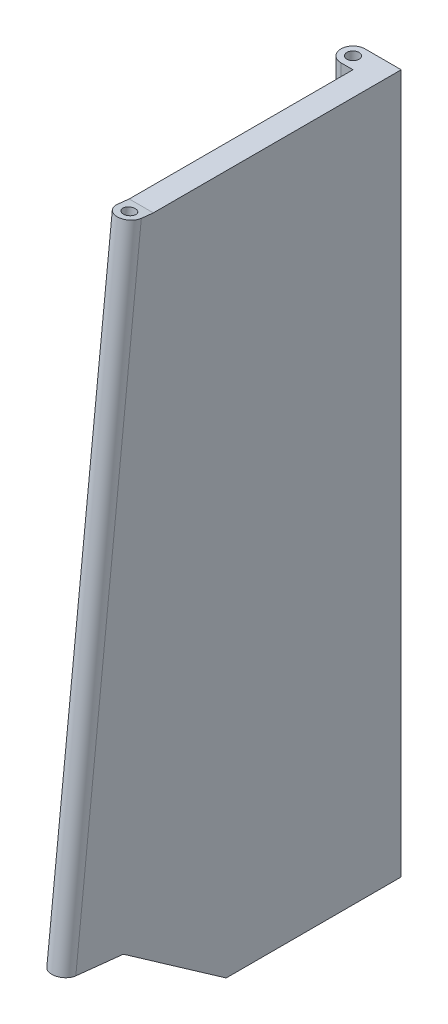
ISO-10303-21;
HEADER;
FILE_DESCRIPTION(('STEP AP214'),'2;1');
FILE_NAME('part.step','',(''),(''),'','','');
FILE_SCHEMA(('AUTOMOTIVE_DESIGN { 1 0 10303 214 1 1 1 1 }'));
ENDSEC;
DATA;
#1=APPLICATION_CONTEXT('core data for automotive mechanical design processes');
#2=APPLICATION_PROTOCOL_DEFINITION('international standard','automotive_design',2000,#1);
#3=PRODUCT_CONTEXT('',#1,'mechanical');
#4=PRODUCT('Part','Part','',(#3));
#5=PRODUCT_RELATED_PRODUCT_CATEGORY('part','',(#4));
#6=PRODUCT_DEFINITION_FORMATION('','',#4);
#7=PRODUCT_DEFINITION_CONTEXT('part definition',#1,'design');
#8=PRODUCT_DEFINITION('design','',#6,#7);
#9=PRODUCT_DEFINITION_SHAPE('','',#8);
#10=(LENGTH_UNIT() NAMED_UNIT(*) SI_UNIT(.MILLI.,.METRE.));
#11=(NAMED_UNIT(*) PLANE_ANGLE_UNIT() SI_UNIT($,.RADIAN.));
#12=(NAMED_UNIT(*) SI_UNIT($,.STERADIAN.) SOLID_ANGLE_UNIT());
#13=UNCERTAINTY_MEASURE_WITH_UNIT(LENGTH_MEASURE(1.E-05),#10,'distance_accuracy_value','');
#14=(GEOMETRIC_REPRESENTATION_CONTEXT(3) GLOBAL_UNCERTAINTY_ASSIGNED_CONTEXT((#13)) GLOBAL_UNIT_ASSIGNED_CONTEXT((#10,
#11,#12)) REPRESENTATION_CONTEXT('',''));
#15=CARTESIAN_POINT('',(0.,0.,0.));
#16=DIRECTION('',(0.,0.,1.));
#17=DIRECTION('',(1.,0.,0.));
#18=AXIS2_PLACEMENT_3D('',#15,#16,#17);
#19=CARTESIAN_POINT('',(0.,0.,0.));
#20=DIRECTION('',(1.,0.,0.));
#21=DIRECTION('',(0.,0.,-1.));
#22=AXIS2_PLACEMENT_3D('',#19,#20,#21);
#23=PLANE('',#22);
#24=DIRECTION('',(0.,-1.,0.));
#25=VECTOR('',#24,1.);
#26=CARTESIAN_POINT('',(0.,60.8284271247462,2.));
#27=LINE('',#26,#25);
#28=CARTESIAN_POINT('',(0.,58.,2.));
#29=VERTEX_POINT('',#28);
#30=CARTESIAN_POINT('',(0.,0.,2.));
#31=VERTEX_POINT('',#30);
#32=EDGE_CURVE('E49',#29,#31,#27,.T.);
#33=ORIENTED_EDGE('',*,*,#32,.T.);
#34=DIRECTION('',(0.,0.,-1.));
#35=VECTOR('',#34,1.);
#36=CARTESIAN_POINT('',(0.,0.,14.5181284096406));
#37=LINE('',#36,#35);
#38=CARTESIAN_POINT('',(0.,0.,14.5181284096406));
#39=VERTEX_POINT('',#38);
#40=EDGE_CURVE('E130',#39,#31,#37,.T.);
#41=ORIENTED_EDGE('',*,*,#40,.F.);
#42=DIRECTION('',(0.,-0.573576436351041,-0.819152044288995));
#43=VECTOR('',#42,1.);
#44=CARTESIAN_POINT('',(0.,0.,14.5181284096406));
#45=LINE('',#44,#43);
#46=CARTESIAN_POINT('',(0.,5.97493166501007,23.0512151574452));
#47=VERTEX_POINT('',#46);
#48=EDGE_CURVE('E127',#47,#39,#45,.T.);
#49=ORIENTED_EDGE('',*,*,#48,.F.);
#50=DIRECTION('',(0.,-0.104528463267654,-0.994521895368273));
#51=VECTOR('',#50,1.);
#52=CARTESIAN_POINT('',(0.,6.28486144084982,26.));
#53=LINE('',#52,#51);
#54=CARTESIAN_POINT('',(0.,6.38938990411747,26.9945218953683));
#55=VERTEX_POINT('',#54);
#56=EDGE_CURVE('E125',#55,#47,#53,.T.);
#57=ORIENTED_EDGE('',*,*,#56,.F.);
#58=DIRECTION('',(0.,-0.994521895368273,0.104528463267654));
#59=VECTOR('',#58,1.);
#60=CARTESIAN_POINT('',(0.,58.1045284632677,21.5590418054503));
#61=LINE('',#60,#59);
#62=CARTESIAN_POINT('',(0.,58.1045284632677,21.5590418054503));
#63=VERTEX_POINT('',#62);
#64=EDGE_CURVE('E176',#63,#55,#61,.T.);
#65=ORIENTED_EDGE('',*,*,#64,.F.);
#66=DIRECTION('',(0.,-0.104528463267655,-0.994521895368273));
#67=VECTOR('',#66,1.);
#68=CARTESIAN_POINT('',(0.,58.,20.564519910082));
#69=LINE('',#68,#67);
#70=CARTESIAN_POINT('',(0.,58.,20.5645199100818));
#71=VERTEX_POINT('',#70);
#72=EDGE_CURVE('E172',#63,#71,#69,.T.);
#73=ORIENTED_EDGE('',*,*,#72,.T.);
#74=DIRECTION('',(0.,0.,1.));
#75=VECTOR('',#74,1.);
#76=CARTESIAN_POINT('',(0.,58.,0.));
#77=LINE('',#76,#75);
#78=EDGE_CURVE('E75',#29,#71,#77,.T.);
#79=ORIENTED_EDGE('',*,*,#78,.F.);
#80=EDGE_LOOP('',(#33,#41,#49,#57,#65,#73,#79));
#81=FACE_BOUND('',#80,.T.);
#82=ADVANCED_FACE('F34',(#81),#23,.F.);
#83=CARTESIAN_POINT('',(2.,6.28486144084982,26.));
#84=DIRECTION('',(0.,0.994521895368273,-0.104528463267654));
#85=DIRECTION('',(0.,0.104528463267654,0.994521895368273));
#86=AXIS2_PLACEMENT_3D('',#83,#84,#85);
#87=PLANE('',#86);
#88=ORIENTED_EDGE('',*,*,#56,.T.);
#89=DIRECTION('',(-1.,0.,0.));
#90=VECTOR('',#89,1.);
#91=CARTESIAN_POINT('',(2.,5.97493166501007,23.0512151574452));
#92=LINE('',#91,#90);
#93=CARTESIAN_POINT('',(2.,5.97493166501007,23.0512151574452));
#94=VERTEX_POINT('',#93);
#95=EDGE_CURVE('E11',#94,#47,#92,.T.);
#96=ORIENTED_EDGE('',*,*,#95,.F.);
#97=DIRECTION('',(0.,-0.104528463267654,-0.994521895368273));
#98=VECTOR('',#97,1.);
#99=CARTESIAN_POINT('',(2.,6.28486144084982,26.));
#100=LINE('',#99,#98);
#101=CARTESIAN_POINT('',(2.,6.38938990411747,26.9945218953683));
#102=VERTEX_POINT('',#101);
#103=EDGE_CURVE('E83',#102,#94,#100,.T.);
#104=ORIENTED_EDGE('',*,*,#103,.F.);
#105=CARTESIAN_POINT('',(1.,6.38938990411747,26.9945218953683));
#106=DIRECTION('',(0.,-0.994521895368273,0.104528463267654));
#107=DIRECTION('',(0.,0.104528463267654,0.994521895368273));
#108=AXIS2_PLACEMENT_3D('',#105,#106,#107);
#109=CIRCLE('',#108,1.);
#110=EDGE_CURVE('E166',#102,#55,#109,.T.);
#111=ORIENTED_EDGE('',*,*,#110,.T.);
#112=EDGE_LOOP('',(#88,#96,#104,#111));
#113=FACE_BOUND('',#112,.T.);
#114=CARTESIAN_POINT('',(1.,6.38938990411747,26.9945218953683));
#115=DIRECTION('',(0.,-0.994521895368273,0.104528463267654));
#116=DIRECTION('',(0.,-0.104528463267654,-0.994521895368273));
#117=AXIS2_PLACEMENT_3D('',#114,#115,#116);
#118=CIRCLE('',#117,0.5);
#119=CARTESIAN_POINT('',(1.,6.33712567248364,26.4972609476841));
#120=VERTEX_POINT('',#119);
#121=EDGE_CURVE('E148',#120,#120,#118,.T.);
#122=ORIENTED_EDGE('',*,*,#121,.F.);
#123=EDGE_LOOP('',(#122));
#124=FACE_BOUND('',#123,.T.);
#125=ADVANCED_FACE('F36',(#113,#124),#87,.F.);
#126=CARTESIAN_POINT('',(2.,0.,14.5181284096406));
#127=DIRECTION('',(0.,0.819152044288995,-0.573576436351041));
#128=DIRECTION('',(0.,0.573576436351041,0.819152044288995));
#129=AXIS2_PLACEMENT_3D('',#126,#127,#128);
#130=PLANE('',#129);
#131=ORIENTED_EDGE('',*,*,#48,.T.);
#132=DIRECTION('',(-1.,0.,0.));
#133=VECTOR('',#132,1.);
#134=CARTESIAN_POINT('',(2.,0.,14.5181284096406));
#135=LINE('',#134,#133);
#136=CARTESIAN_POINT('',(2.,0.,14.5181284096406));
#137=VERTEX_POINT('',#136);
#138=EDGE_CURVE('E42',#137,#39,#135,.T.);
#139=ORIENTED_EDGE('',*,*,#138,.F.);
#140=DIRECTION('',(0.,-0.573576436351041,-0.819152044288995));
#141=VECTOR('',#140,1.);
#142=CARTESIAN_POINT('',(2.,0.,14.5181284096406));
#143=LINE('',#142,#141);
#144=EDGE_CURVE('E98',#94,#137,#143,.T.);
#145=ORIENTED_EDGE('',*,*,#144,.F.);
#146=ORIENTED_EDGE('',*,*,#95,.T.);
#147=EDGE_LOOP('',(#131,#139,#145,#146));
#148=FACE_BOUND('',#147,.T.);
#149=ADVANCED_FACE('F227',(#148),#130,.F.);
#150=CARTESIAN_POINT('',(2.,0.,14.5181284096406));
#151=DIRECTION('',(0.,1.,0.));
#152=DIRECTION('',(0.,0.,1.));
#153=AXIS2_PLACEMENT_3D('',#150,#151,#152);
#154=PLANE('',#153);
#155=ORIENTED_EDGE('',*,*,#40,.T.);
#156=DIRECTION('',(1.,0.,0.));
#157=VECTOR('',#156,1.);
#158=CARTESIAN_POINT('',(0.,0.,2.));
#159=LINE('',#158,#157);
#160=CARTESIAN_POINT('',(-1.,0.,2.));
#161=VERTEX_POINT('',#160);
#162=EDGE_CURVE('E145',#161,#31,#159,.T.);
#163=ORIENTED_EDGE('',*,*,#162,.F.);
#164=CARTESIAN_POINT('',(-1.,0.,1.));
#165=DIRECTION('',(0.,1.,0.));
#166=DIRECTION('',(0.,0.,-1.));
#167=AXIS2_PLACEMENT_3D('',#164,#165,#166);
#168=CIRCLE('',#167,1.);
#169=CARTESIAN_POINT('',(-1.,0.,0.));
#170=VERTEX_POINT('',#169);
#171=EDGE_CURVE('E112',#170,#161,#168,.T.);
#172=ORIENTED_EDGE('',*,*,#171,.F.);
#173=DIRECTION('',(-1.,0.,0.));
#174=VECTOR('',#173,1.);
#175=CARTESIAN_POINT('',(2.,0.,0.));
#176=LINE('',#175,#174);
#177=CARTESIAN_POINT('',(2.,0.,0.));
#178=VERTEX_POINT('',#177);
#179=EDGE_CURVE('E105',#178,#170,#176,.T.);
#180=ORIENTED_EDGE('',*,*,#179,.F.);
#181=DIRECTION('',(0.,0.,-1.));
#182=VECTOR('',#181,1.);
#183=CARTESIAN_POINT('',(2.,0.,14.5181284096406));
#184=LINE('',#183,#182);
#185=EDGE_CURVE('E91',#137,#178,#184,.T.);
#186=ORIENTED_EDGE('',*,*,#185,.F.);
#187=ORIENTED_EDGE('',*,*,#138,.T.);
#188=EDGE_LOOP('',(#155,#163,#172,#180,#186,#187));
#189=FACE_BOUND('',#188,.T.);
#190=CARTESIAN_POINT('',(-1.,0.,1.));
#191=DIRECTION('',(0.,1.,0.));
#192=DIRECTION('',(0.,0.,1.));
#193=AXIS2_PLACEMENT_3D('',#190,#191,#192);
#194=CIRCLE('',#193,0.5);
#195=CARTESIAN_POINT('',(-1.,0.,1.5));
#196=VERTEX_POINT('',#195);
#197=EDGE_CURVE('E160',#196,#196,#194,.T.);
#198=ORIENTED_EDGE('',*,*,#197,.T.);
#199=EDGE_LOOP('',(#198));
#200=FACE_BOUND('',#199,.T.);
#201=ADVANCED_FACE('F107',(#189,#200),#154,.F.);
#202=CARTESIAN_POINT('',(2.,0.,0.));
#203=DIRECTION('',(0.,0.,1.));
#204=DIRECTION('',(1.,0.,0.));
#205=AXIS2_PLACEMENT_3D('',#202,#203,#204);
#206=PLANE('',#205);
#207=ORIENTED_EDGE('',*,*,#179,.T.);
#208=DIRECTION('',(0.,-1.,0.));
#209=VECTOR('',#208,1.);
#210=CARTESIAN_POINT('',(-1.,60.8284271247462,0.));
#211=LINE('',#210,#209);
#212=CARTESIAN_POINT('',(-1.,58.,0.));
#213=VERTEX_POINT('',#212);
#214=EDGE_CURVE('E155',#213,#170,#211,.T.);
#215=ORIENTED_EDGE('',*,*,#214,.F.);
#216=DIRECTION('',(-1.,0.,0.));
#217=VECTOR('',#216,1.);
#218=CARTESIAN_POINT('',(2.,58.,0.));
#219=LINE('',#218,#217);
#220=CARTESIAN_POINT('',(2.,58.,0.));
#221=VERTEX_POINT('',#220);
#222=EDGE_CURVE('E116',#221,#213,#219,.T.);
#223=ORIENTED_EDGE('',*,*,#222,.F.);
#224=DIRECTION('',(0.,1.,0.));
#225=VECTOR('',#224,1.);
#226=CARTESIAN_POINT('',(2.,0.,0.));
#227=LINE('',#226,#225);
#228=EDGE_CURVE('E95',#178,#221,#227,.T.);
#229=ORIENTED_EDGE('',*,*,#228,.F.);
#230=EDGE_LOOP('',(#207,#215,#223,#229));
#231=FACE_BOUND('',#230,.T.);
#232=ADVANCED_FACE('F118',(#231),#206,.F.);
#233=CARTESIAN_POINT('',(2.,58.,0.));
#234=DIRECTION('',(0.,-1.,0.));
#235=DIRECTION('',(0.,0.,-1.));
#236=AXIS2_PLACEMENT_3D('',#233,#234,#235);
#237=PLANE('',#236);
#238=ORIENTED_EDGE('',*,*,#222,.T.);
#239=CARTESIAN_POINT('',(-1.,58.,1.));
#240=DIRECTION('',(0.,-1.,0.));
#241=DIRECTION('',(0.,0.,-1.));
#242=AXIS2_PLACEMENT_3D('',#239,#240,#241);
#243=CIRCLE('',#242,1.);
#244=CARTESIAN_POINT('',(-1.,58.,2.));
#245=VERTEX_POINT('',#244);
#246=EDGE_CURVE('E157',#245,#213,#243,.T.);
#247=ORIENTED_EDGE('',*,*,#246,.F.);
#248=DIRECTION('',(-1.,0.,0.));
#249=VECTOR('',#248,1.);
#250=CARTESIAN_POINT('',(0.,58.,2.));
#251=LINE('',#250,#249);
#252=EDGE_CURVE('E161',#29,#245,#251,.T.);
#253=ORIENTED_EDGE('',*,*,#252,.F.);
#254=ORIENTED_EDGE('',*,*,#78,.T.);
#255=DIRECTION('',(-1.,0.,0.));
#256=VECTOR('',#255,1.);
#257=CARTESIAN_POINT('',(2.,58.,20.5645199100818));
#258=LINE('',#257,#256);
#259=CARTESIAN_POINT('',(2.,58.,20.5645199100818));
#260=VERTEX_POINT('',#259);
#261=EDGE_CURVE('E121',#260,#71,#258,.T.);
#262=ORIENTED_EDGE('',*,*,#261,.F.);
#263=DIRECTION('',(0.,0.,1.));
#264=VECTOR('',#263,1.);
#265=CARTESIAN_POINT('',(2.,58.,0.));
#266=LINE('',#265,#264);
#267=EDGE_CURVE('E58',#221,#260,#266,.T.);
#268=ORIENTED_EDGE('',*,*,#267,.F.);
#269=EDGE_LOOP('',(#238,#247,#253,#254,#262,#268));
#270=FACE_BOUND('',#269,.T.);
#271=CARTESIAN_POINT('',(-1.,58.,1.));
#272=DIRECTION('',(0.,-1.,0.));
#273=DIRECTION('',(0.,0.,-1.));
#274=AXIS2_PLACEMENT_3D('',#271,#272,#273);
#275=CIRCLE('',#274,0.5);
#276=CARTESIAN_POINT('',(-1.,58.,0.5));
#277=VERTEX_POINT('',#276);
#278=EDGE_CURVE('E144',#277,#277,#275,.T.);
#279=ORIENTED_EDGE('',*,*,#278,.T.);
#280=EDGE_LOOP('',(#279));
#281=FACE_BOUND('',#280,.T.);
#282=ADVANCED_FACE('F205',(#270,#281),#237,.F.);
#283=CARTESIAN_POINT('',(2.,0.,0.));
#284=DIRECTION('',(1.,0.,0.));
#285=DIRECTION('',(0.,0.,-1.));
#286=AXIS2_PLACEMENT_3D('',#283,#284,#285);
#287=PLANE('',#286);
#288=ORIENTED_EDGE('',*,*,#267,.T.);
#289=DIRECTION('',(0.,0.104528463267655,0.994521895368273));
#290=VECTOR('',#289,1.);
#291=CARTESIAN_POINT('',(2.,58.,20.564519910082));
#292=LINE('',#291,#290);
#293=CARTESIAN_POINT('',(2.,58.1045284632677,21.5590418054503));
#294=VERTEX_POINT('',#293);
#295=EDGE_CURVE('E174',#260,#294,#292,.T.);
#296=ORIENTED_EDGE('',*,*,#295,.T.);
#297=DIRECTION('',(0.,-0.994521895368273,0.104528463267654));
#298=VECTOR('',#297,1.);
#299=CARTESIAN_POINT('',(2.,58.1045284632677,21.5590418054503));
#300=LINE('',#299,#298);
#301=EDGE_CURVE('E128',#294,#102,#300,.T.);
#302=ORIENTED_EDGE('',*,*,#301,.T.);
#303=ORIENTED_EDGE('',*,*,#103,.T.);
#304=ORIENTED_EDGE('',*,*,#144,.T.);
#305=ORIENTED_EDGE('',*,*,#185,.T.);
#306=ORIENTED_EDGE('',*,*,#228,.T.);
#307=EDGE_LOOP('',(#288,#296,#302,#303,#304,#305,#306));
#308=FACE_BOUND('',#307,.T.);
#309=ADVANCED_FACE('F93',(#308),#287,.T.);
#310=CARTESIAN_POINT('',(1.,58.1045284632677,21.5590418054503));
#311=DIRECTION('',(0.,-0.994521895368273,0.104528463267654));
#312=DIRECTION('',(0.,-0.104528463267654,-0.994521895368273));
#313=AXIS2_PLACEMENT_3D('',#310,#311,#312);
#314=CYLINDRICAL_SURFACE('',#313,1.);
#315=ORIENTED_EDGE('',*,*,#110,.F.);
#316=ORIENTED_EDGE('',*,*,#301,.F.);
#317=CARTESIAN_POINT('',(1.,58.1045284632677,21.5590418054503));
#318=DIRECTION('',(0.,-0.994521895368273,0.104528463267654));
#319=DIRECTION('',(0.,0.104528463267654,0.994521895368273));
#320=AXIS2_PLACEMENT_3D('',#317,#318,#319);
#321=CIRCLE('',#320,1.);
#322=EDGE_CURVE('E169',#294,#63,#321,.T.);
#323=ORIENTED_EDGE('',*,*,#322,.T.);
#324=ORIENTED_EDGE('',*,*,#64,.T.);
#325=EDGE_LOOP('',(#315,#316,#323,#324));
#326=FACE_BOUND('',#325,.T.);
#327=ADVANCED_FACE('F186',(#326),#314,.T.);
#328=CARTESIAN_POINT('',(1.,58.1045284632677,21.5590418054503));
#329=DIRECTION('',(0.,0.994521895368273,-0.104528463267654));
#330=DIRECTION('',(0.,0.104528463267654,0.994521895368273));
#331=AXIS2_PLACEMENT_3D('',#328,#329,#330);
#332=PLANE('',#331);
#333=CARTESIAN_POINT('',(1.,58.1045284632677,21.5590418054503));
#334=DIRECTION('',(0.,-0.994521895368273,0.104528463267654));
#335=DIRECTION('',(0.,-0.104528463267654,-0.994521895368273));
#336=AXIS2_PLACEMENT_3D('',#333,#334,#335);
#337=CIRCLE('',#336,0.5);
#338=CARTESIAN_POINT('',(1.,58.0522642316338,21.0617808577661));
#339=VERTEX_POINT('',#338);
#340=EDGE_CURVE('E163',#339,#339,#337,.T.);
#341=ORIENTED_EDGE('',*,*,#340,.T.);
#342=EDGE_LOOP('',(#341));
#343=FACE_BOUND('',#342,.T.);
#344=ORIENTED_EDGE('',*,*,#322,.F.);
#345=ORIENTED_EDGE('',*,*,#295,.F.);
#346=ORIENTED_EDGE('',*,*,#261,.T.);
#347=ORIENTED_EDGE('',*,*,#72,.F.);
#348=EDGE_LOOP('',(#344,#345,#346,#347));
#349=FACE_BOUND('',#348,.T.);
#350=ADVANCED_FACE('F197',(#343,#349),#332,.T.);
#351=CARTESIAN_POINT('',(1.,58.1045284632677,21.5590418054503));
#352=DIRECTION('',(0.,-0.994521895368273,0.104528463267654));
#353=DIRECTION('',(0.,-0.104528463267654,-0.994521895368273));
#354=AXIS2_PLACEMENT_3D('',#351,#352,#353);
#355=CYLINDRICAL_SURFACE('',#354,0.5);
#356=ORIENTED_EDGE('',*,*,#340,.F.);
#357=EDGE_LOOP('',(#356));
#358=FACE_BOUND('',#357,.T.);
#359=ORIENTED_EDGE('',*,*,#121,.T.);
#360=EDGE_LOOP('',(#359));
#361=FACE_BOUND('',#360,.T.);
#362=ADVANCED_FACE('F220',(#358,#361),#355,.F.);
#363=CARTESIAN_POINT('',(-1.,60.8284271247462,1.));
#364=DIRECTION('',(0.,-1.,0.));
#365=DIRECTION('',(0.,0.,-1.));
#366=AXIS2_PLACEMENT_3D('',#363,#364,#365);
#367=CYLINDRICAL_SURFACE('',#366,1.);
#368=DIRECTION('',(0.,-1.,0.));
#369=VECTOR('',#368,1.);
#370=CARTESIAN_POINT('',(-1.,60.8284271247462,2.));
#371=LINE('',#370,#369);
#372=EDGE_CURVE('E150',#245,#161,#371,.T.);
#373=ORIENTED_EDGE('',*,*,#372,.F.);
#374=ORIENTED_EDGE('',*,*,#246,.T.);
#375=ORIENTED_EDGE('',*,*,#214,.T.);
#376=ORIENTED_EDGE('',*,*,#171,.T.);
#377=EDGE_LOOP('',(#373,#374,#375,#376));
#378=FACE_BOUND('',#377,.T.);
#379=ADVANCED_FACE('F209',(#378),#367,.T.);
#380=CARTESIAN_POINT('',(0.,60.8284271247462,2.));
#381=DIRECTION('',(0.,0.,-1.));
#382=DIRECTION('',(-1.,0.,0.));
#383=AXIS2_PLACEMENT_3D('',#380,#381,#382);
#384=PLANE('',#383);
#385=ORIENTED_EDGE('',*,*,#32,.F.);
#386=ORIENTED_EDGE('',*,*,#252,.T.);
#387=ORIENTED_EDGE('',*,*,#372,.T.);
#388=ORIENTED_EDGE('',*,*,#162,.T.);
#389=EDGE_LOOP('',(#385,#386,#387,#388));
#390=FACE_BOUND('',#389,.T.);
#391=ADVANCED_FACE('F210',(#390),#384,.F.);
#392=CARTESIAN_POINT('',(-1.,60.8284271247462,1.));
#393=DIRECTION('',(0.,-1.,0.));
#394=DIRECTION('',(0.,0.,-1.));
#395=AXIS2_PLACEMENT_3D('',#392,#393,#394);
#396=CYLINDRICAL_SURFACE('',#395,0.5);
#397=ORIENTED_EDGE('',*,*,#278,.F.);
#398=EDGE_LOOP('',(#397));
#399=FACE_BOUND('',#398,.T.);
#400=ORIENTED_EDGE('',*,*,#197,.F.);
#401=EDGE_LOOP('',(#400));
#402=FACE_BOUND('',#401,.T.);
#403=ADVANCED_FACE('F212',(#399,#402),#396,.F.);
#404=CLOSED_SHELL('',(#82,#125,#149,#201,#232,#282,#309,#327,#350,#362,#379,#391,#403));
#405=MANIFOLD_SOLID_BREP('B2',#404);
#406=ADVANCED_BREP_SHAPE_REPRESENTATION('',(#18,#405),#14);
#407=SHAPE_DEFINITION_REPRESENTATION(#9,#406);
ENDSEC;
END-ISO-10303-21;
